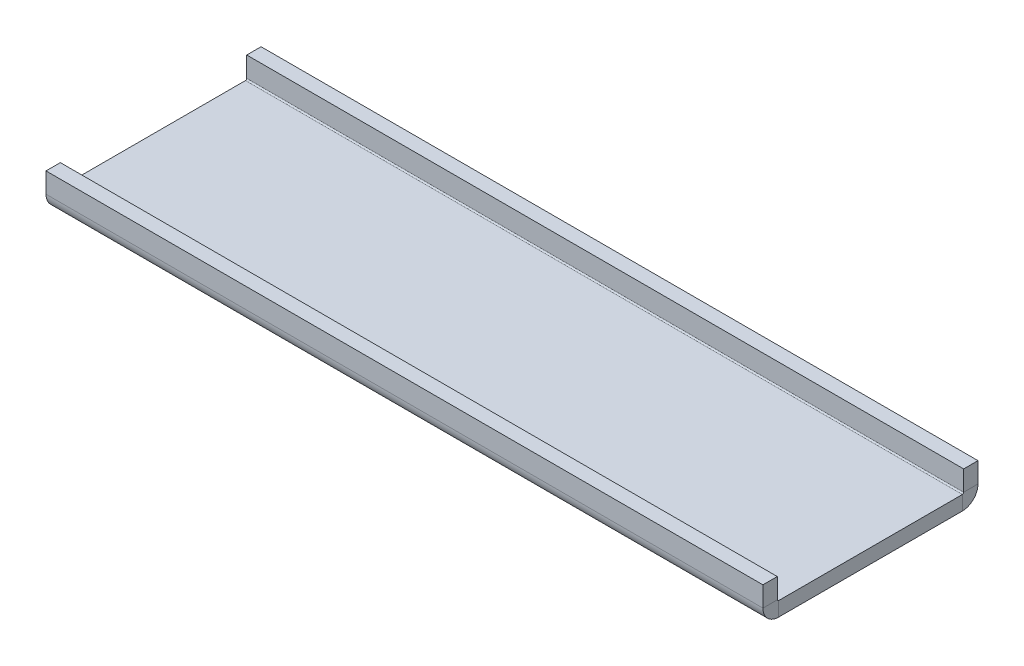
ISO-10303-21;
HEADER;
FILE_DESCRIPTION(('STEP AP214'),'2;1');
FILE_NAME('part.step','',(''),(''),'','','');
FILE_SCHEMA(('AUTOMOTIVE_DESIGN { 1 0 10303 214 1 1 1 1 }'));
ENDSEC;
DATA;
#1=APPLICATION_CONTEXT('core data for automotive mechanical design processes');
#2=APPLICATION_PROTOCOL_DEFINITION('international standard','automotive_design',2000,#1);
#3=PRODUCT_CONTEXT('',#1,'mechanical');
#4=PRODUCT('Part','Part','',(#3));
#5=PRODUCT_RELATED_PRODUCT_CATEGORY('part','',(#4));
#6=PRODUCT_DEFINITION_FORMATION('','',#4);
#7=PRODUCT_DEFINITION_CONTEXT('part definition',#1,'design');
#8=PRODUCT_DEFINITION('design','',#6,#7);
#9=PRODUCT_DEFINITION_SHAPE('','',#8);
#10=(LENGTH_UNIT() NAMED_UNIT(*) SI_UNIT(.MILLI.,.METRE.));
#11=(NAMED_UNIT(*) PLANE_ANGLE_UNIT() SI_UNIT($,.RADIAN.));
#12=(NAMED_UNIT(*) SI_UNIT($,.STERADIAN.) SOLID_ANGLE_UNIT());
#13=UNCERTAINTY_MEASURE_WITH_UNIT(LENGTH_MEASURE(1.E-05),#10,'distance_accuracy_value','');
#14=(GEOMETRIC_REPRESENTATION_CONTEXT(3) GLOBAL_UNCERTAINTY_ASSIGNED_CONTEXT((#13)) GLOBAL_UNIT_ASSIGNED_CONTEXT((#10,
#11,#12)) REPRESENTATION_CONTEXT('',''));
#15=CARTESIAN_POINT('',(0.,0.,0.));
#16=DIRECTION('',(0.,0.,1.));
#17=DIRECTION('',(1.,0.,0.));
#18=AXIS2_PLACEMENT_3D('',#15,#16,#17);
#19=CARTESIAN_POINT('',(0.,-4.,0.));
#20=DIRECTION('',(0.,1.,0.));
#21=DIRECTION('',(0.,0.,1.));
#22=AXIS2_PLACEMENT_3D('',#19,#20,#21);
#23=PLANE('',#22);
#24=DIRECTION('',(-1.,0.,0.));
#25=VECTOR('',#24,1.);
#26=CARTESIAN_POINT('',(-200.,-4.,-111.2634));
#27=LINE('',#26,#25);
#28=CARTESIAN_POINT('',(-200.,-4.,-111.2634));
#29=VERTEX_POINT('',#28);
#30=CARTESIAN_POINT('',(200.,-4.,-111.2634));
#31=VERTEX_POINT('',#30);
#32=EDGE_CURVE('E181',#29,#31,#27,.F.);
#33=ORIENTED_EDGE('',*,*,#32,.T.);
#34=DIRECTION('',(0.,0.,-1.));
#35=VECTOR('',#34,1.);
#36=CARTESIAN_POINT('',(200.,-4.,0.));
#37=LINE('',#36,#35);
#38=CARTESIAN_POINT('',(200.,-4.,-8.7366));
#39=VERTEX_POINT('',#38);
#40=EDGE_CURVE('E92',#39,#31,#37,.T.);
#41=ORIENTED_EDGE('',*,*,#40,.F.);
#42=DIRECTION('',(1.,0.,0.));
#43=VECTOR('',#42,1.);
#44=CARTESIAN_POINT('',(200.,-4.,-8.7366));
#45=LINE('',#44,#43);
#46=CARTESIAN_POINT('',(-200.,-4.,-8.7366));
#47=VERTEX_POINT('',#46);
#48=EDGE_CURVE('E276',#39,#47,#45,.F.);
#49=ORIENTED_EDGE('',*,*,#48,.T.);
#50=DIRECTION('',(0.,0.,1.));
#51=VECTOR('',#50,1.);
#52=CARTESIAN_POINT('',(-200.,-4.,-120.));
#53=LINE('',#52,#51);
#54=EDGE_CURVE('E13',#29,#47,#53,.T.);
#55=ORIENTED_EDGE('',*,*,#54,.F.);
#56=EDGE_LOOP('',(#33,#41,#49,#55));
#57=FACE_BOUND('',#56,.T.);
#58=ADVANCED_FACE('F83',(#57),#23,.F.);
#59=CARTESIAN_POINT('',(0.,4.,0.));
#60=DIRECTION('',(0.,1.,0.));
#61=DIRECTION('',(0.,0.,1.));
#62=AXIS2_PLACEMENT_3D('',#59,#60,#61);
#63=PLANE('',#62);
#64=DIRECTION('',(0.,0.,-1.));
#65=VECTOR('',#64,1.);
#66=CARTESIAN_POINT('',(200.,4.,0.));
#67=LINE('',#66,#65);
#68=CARTESIAN_POINT('',(200.,4.,-8.7366));
#69=VERTEX_POINT('',#68);
#70=CARTESIAN_POINT('',(200.,4.,-111.2634));
#71=VERTEX_POINT('',#70);
#72=EDGE_CURVE('E294',#69,#71,#67,.T.);
#73=ORIENTED_EDGE('',*,*,#72,.T.);
#74=DIRECTION('',(-1.,0.,0.));
#75=VECTOR('',#74,1.);
#76=CARTESIAN_POINT('',(-200.,4.,-111.2634));
#77=LINE('',#76,#75);
#78=CARTESIAN_POINT('',(-200.,4.,-111.2634));
#79=VERTEX_POINT('',#78);
#80=EDGE_CURVE('E235',#79,#71,#77,.F.);
#81=ORIENTED_EDGE('',*,*,#80,.F.);
#82=DIRECTION('',(0.,0.,1.));
#83=VECTOR('',#82,1.);
#84=CARTESIAN_POINT('',(-200.,4.,-120.));
#85=LINE('',#84,#83);
#86=CARTESIAN_POINT('',(-200.,4.,-8.7366));
#87=VERTEX_POINT('',#86);
#88=EDGE_CURVE('E87',#79,#87,#85,.T.);
#89=ORIENTED_EDGE('',*,*,#88,.T.);
#90=DIRECTION('',(1.,0.,0.));
#91=VECTOR('',#90,1.);
#92=CARTESIAN_POINT('',(200.,4.,-8.7366));
#93=LINE('',#92,#91);
#94=EDGE_CURVE('E100',#69,#87,#93,.F.);
#95=ORIENTED_EDGE('',*,*,#94,.F.);
#96=EDGE_LOOP('',(#73,#81,#89,#95));
#97=FACE_BOUND('',#96,.T.);
#98=ADVANCED_FACE('F299',(#97),#63,.T.);
#99=CARTESIAN_POINT('',(-200.,-4.,-120.));
#100=DIRECTION('',(-1.,0.,0.));
#101=DIRECTION('',(0.,0.,1.));
#102=AXIS2_PLACEMENT_3D('',#99,#100,#101);
#103=PLANE('',#102);
#104=ORIENTED_EDGE('',*,*,#88,.F.);
#105=DIRECTION('',(0.,-1.,0.));
#106=VECTOR('',#105,1.);
#107=CARTESIAN_POINT('',(-200.,4.,-111.2634));
#108=LINE('',#107,#106);
#109=EDGE_CURVE('E231',#79,#29,#108,.T.);
#110=ORIENTED_EDGE('',*,*,#109,.T.);
#111=ORIENTED_EDGE('',*,*,#54,.T.);
#112=DIRECTION('',(0.,-1.,0.));
#113=VECTOR('',#112,1.);
#114=CARTESIAN_POINT('',(-200.,4.,-8.7366));
#115=LINE('',#114,#113);
#116=EDGE_CURVE('E291',#87,#47,#115,.T.);
#117=ORIENTED_EDGE('',*,*,#116,.F.);
#118=EDGE_LOOP('',(#104,#110,#111,#117));
#119=FACE_BOUND('',#118,.T.);
#120=ADVANCED_FACE('F300',(#119),#103,.T.);
#121=CARTESIAN_POINT('',(200.,-4.,0.));
#122=DIRECTION('',(1.,0.,0.));
#123=DIRECTION('',(0.,0.,-1.));
#124=AXIS2_PLACEMENT_3D('',#121,#122,#123);
#125=PLANE('',#124);
#126=DIRECTION('',(0.,-1.,0.));
#127=VECTOR('',#126,1.);
#128=CARTESIAN_POINT('',(200.,4.,-111.2634));
#129=LINE('',#128,#127);
#130=EDGE_CURVE('E239',#71,#31,#129,.T.);
#131=ORIENTED_EDGE('',*,*,#130,.F.);
#132=ORIENTED_EDGE('',*,*,#72,.F.);
#133=DIRECTION('',(0.,-1.,0.));
#134=VECTOR('',#133,1.);
#135=CARTESIAN_POINT('',(200.,4.,-8.7366));
#136=LINE('',#135,#134);
#137=EDGE_CURVE('E282',#69,#39,#136,.T.);
#138=ORIENTED_EDGE('',*,*,#137,.T.);
#139=ORIENTED_EDGE('',*,*,#40,.T.);
#140=EDGE_LOOP('',(#131,#132,#138,#139));
#141=FACE_BOUND('',#140,.T.);
#142=ADVANCED_FACE('F85',(#141),#125,.T.);
#143=CARTESIAN_POINT('',(-200.,4.7366,-8.7366));
#144=DIRECTION('',(-1.,0.,0.));
#145=DIRECTION('',(0.,0.,1.));
#146=AXIS2_PLACEMENT_3D('',#143,#144,#145);
#147=PLANE('',#146);
#148=DIRECTION('',(0.,0.,1.));
#149=VECTOR('',#148,1.);
#150=CARTESIAN_POINT('',(-200.,4.7366,0.));
#151=LINE('',#150,#149);
#152=CARTESIAN_POINT('',(-200.,4.73659999999999,-8.));
#153=VERTEX_POINT('',#152);
#154=CARTESIAN_POINT('',(-200.,4.73659999999997,0.));
#155=VERTEX_POINT('',#154);
#156=EDGE_CURVE('E242',#153,#155,#151,.T.);
#157=ORIENTED_EDGE('',*,*,#156,.F.);
#158=CARTESIAN_POINT('',(-200.,4.7366,-8.7366));
#159=DIRECTION('',(1.,0.,0.));
#160=DIRECTION('',(0.,0.,-1.));
#161=AXIS2_PLACEMENT_3D('',#158,#159,#160);
#162=CIRCLE('',#161,0.7366);
#163=EDGE_CURVE('E285',#87,#153,#162,.F.);
#164=ORIENTED_EDGE('',*,*,#163,.F.);
#165=ORIENTED_EDGE('',*,*,#116,.T.);
#166=CARTESIAN_POINT('',(-200.,4.7366,-8.7366));
#167=DIRECTION('',(1.,0.,0.));
#168=DIRECTION('',(0.,0.,-1.));
#169=AXIS2_PLACEMENT_3D('',#166,#167,#168);
#170=CIRCLE('',#169,8.7366);
#171=EDGE_CURVE('E278',#47,#155,#170,.F.);
#172=ORIENTED_EDGE('',*,*,#171,.T.);
#173=EDGE_LOOP('',(#157,#164,#165,#172));
#174=FACE_BOUND('',#173,.T.);
#175=ADVANCED_FACE('F308',(#174),#147,.T.);
#176=CARTESIAN_POINT('',(200.,4.7366,-8.7366));
#177=DIRECTION('',(-1.,0.,0.));
#178=DIRECTION('',(0.,0.,1.));
#179=AXIS2_PLACEMENT_3D('',#176,#177,#178);
#180=PLANE('',#179);
#181=CARTESIAN_POINT('',(200.,4.7366,-8.7366));
#182=DIRECTION('',(1.,0.,0.));
#183=DIRECTION('',(0.,0.,-1.));
#184=AXIS2_PLACEMENT_3D('',#181,#182,#183);
#185=CIRCLE('',#184,0.7366);
#186=CARTESIAN_POINT('',(200.,4.73659999999999,-8.));
#187=VERTEX_POINT('',#186);
#188=EDGE_CURVE('E246',#187,#69,#185,.T.);
#189=ORIENTED_EDGE('',*,*,#188,.F.);
#190=DIRECTION('',(0.,0.,1.));
#191=VECTOR('',#190,1.);
#192=CARTESIAN_POINT('',(200.,4.7366,-8.));
#193=LINE('',#192,#191);
#194=CARTESIAN_POINT('',(200.,4.7366,0.));
#195=VERTEX_POINT('',#194);
#196=EDGE_CURVE('E269',#187,#195,#193,.T.);
#197=ORIENTED_EDGE('',*,*,#196,.T.);
#198=CARTESIAN_POINT('',(200.,4.7366,-8.7366));
#199=DIRECTION('',(1.,0.,0.));
#200=DIRECTION('',(0.,0.,-1.));
#201=AXIS2_PLACEMENT_3D('',#198,#199,#200);
#202=CIRCLE('',#201,8.7366);
#203=EDGE_CURVE('E279',#195,#39,#202,.T.);
#204=ORIENTED_EDGE('',*,*,#203,.T.);
#205=ORIENTED_EDGE('',*,*,#137,.F.);
#206=EDGE_LOOP('',(#189,#197,#204,#205));
#207=FACE_BOUND('',#206,.T.);
#208=ADVANCED_FACE('F328',(#207),#180,.F.);
#209=CARTESIAN_POINT('',(200.,4.7366,-8.7366));
#210=DIRECTION('',(1.,0.,0.));
#211=DIRECTION('',(0.,0.,1.));
#212=AXIS2_PLACEMENT_3D('',#209,#210,#211);
#213=CYLINDRICAL_SURFACE('',#212,8.7366);
#214=ORIENTED_EDGE('',*,*,#48,.F.);
#215=ORIENTED_EDGE('',*,*,#203,.F.);
#216=DIRECTION('',(1.,0.,0.));
#217=VECTOR('',#216,1.);
#218=CARTESIAN_POINT('',(0.,4.7366,0.));
#219=LINE('',#218,#217);
#220=EDGE_CURVE('E266',#155,#195,#219,.T.);
#221=ORIENTED_EDGE('',*,*,#220,.F.);
#222=ORIENTED_EDGE('',*,*,#171,.F.);
#223=EDGE_LOOP('',(#214,#215,#221,#222));
#224=FACE_BOUND('',#223,.T.);
#225=ADVANCED_FACE('F333',(#224),#213,.T.);
#226=CARTESIAN_POINT('',(200.,4.7366,-8.7366));
#227=DIRECTION('',(1.,0.,0.));
#228=DIRECTION('',(0.,0.,1.));
#229=AXIS2_PLACEMENT_3D('',#226,#227,#228);
#230=CYLINDRICAL_SURFACE('',#229,0.7366);
#231=ORIENTED_EDGE('',*,*,#94,.T.);
#232=ORIENTED_EDGE('',*,*,#163,.T.);
#233=DIRECTION('',(-1.,0.,0.));
#234=VECTOR('',#233,1.);
#235=CARTESIAN_POINT('',(-200.,4.7366,-8.));
#236=LINE('',#235,#234);
#237=EDGE_CURVE('E272',#153,#187,#236,.F.);
#238=ORIENTED_EDGE('',*,*,#237,.T.);
#239=ORIENTED_EDGE('',*,*,#188,.T.);
#240=EDGE_LOOP('',(#231,#232,#238,#239));
#241=FACE_BOUND('',#240,.T.);
#242=ADVANCED_FACE('F305',(#241),#230,.F.);
#243=CARTESIAN_POINT('',(200.,3.99999999999997,0.));
#244=DIRECTION('',(1.,0.,0.));
#245=DIRECTION('',(0.,0.,-1.));
#246=AXIS2_PLACEMENT_3D('',#243,#244,#245);
#247=PLANE('',#246);
#248=DIRECTION('',(0.,-1.,0.));
#249=VECTOR('',#248,1.);
#250=CARTESIAN_POINT('',(200.,3.99999999999997,0.));
#251=LINE('',#250,#249);
#252=CARTESIAN_POINT('',(200.,16.,0.));
#253=VERTEX_POINT('',#252);
#254=EDGE_CURVE('E250',#253,#195,#251,.T.);
#255=ORIENTED_EDGE('',*,*,#254,.T.);
#256=ORIENTED_EDGE('',*,*,#196,.F.);
#257=DIRECTION('',(0.,1.,0.));
#258=VECTOR('',#257,1.);
#259=CARTESIAN_POINT('',(200.,0.,-8.00000000000001));
#260=LINE('',#259,#258);
#261=CARTESIAN_POINT('',(200.,16.,-7.99999999999996));
#262=VERTEX_POINT('',#261);
#263=EDGE_CURVE('E258',#262,#187,#260,.F.);
#264=ORIENTED_EDGE('',*,*,#263,.F.);
#265=DIRECTION('',(0.,0.,-1.));
#266=VECTOR('',#265,1.);
#267=CARTESIAN_POINT('',(200.,16.,0.));
#268=LINE('',#267,#266);
#269=EDGE_CURVE('E244',#253,#262,#268,.T.);
#270=ORIENTED_EDGE('',*,*,#269,.F.);
#271=EDGE_LOOP('',(#255,#256,#264,#270));
#272=FACE_BOUND('',#271,.T.);
#273=ADVANCED_FACE('F326',(#272),#247,.T.);
#274=CARTESIAN_POINT('',(-200.,16.,0.));
#275=DIRECTION('',(-1.,0.,0.));
#276=DIRECTION('',(0.,0.,1.));
#277=AXIS2_PLACEMENT_3D('',#274,#275,#276);
#278=PLANE('',#277);
#279=DIRECTION('',(0.,-1.,0.));
#280=VECTOR('',#279,1.);
#281=CARTESIAN_POINT('',(-200.,0.,-8.00000000000001));
#282=LINE('',#281,#280);
#283=CARTESIAN_POINT('',(-200.,16.,-7.99999999999996));
#284=VERTEX_POINT('',#283);
#285=EDGE_CURVE('E264',#153,#284,#282,.F.);
#286=ORIENTED_EDGE('',*,*,#285,.F.);
#287=ORIENTED_EDGE('',*,*,#156,.T.);
#288=DIRECTION('',(0.,1.,0.));
#289=VECTOR('',#288,1.);
#290=CARTESIAN_POINT('',(-200.,16.,0.));
#291=LINE('',#290,#289);
#292=CARTESIAN_POINT('',(-200.,16.,0.));
#293=VERTEX_POINT('',#292);
#294=EDGE_CURVE('E256',#155,#293,#291,.T.);
#295=ORIENTED_EDGE('',*,*,#294,.T.);
#296=DIRECTION('',(0.,0.,-1.));
#297=VECTOR('',#296,1.);
#298=CARTESIAN_POINT('',(-200.,16.,0.));
#299=LINE('',#298,#297);
#300=EDGE_CURVE('E247',#293,#284,#299,.T.);
#301=ORIENTED_EDGE('',*,*,#300,.T.);
#302=EDGE_LOOP('',(#286,#287,#295,#301));
#303=FACE_BOUND('',#302,.T.);
#304=ADVANCED_FACE('F312',(#303),#278,.T.);
#305=CARTESIAN_POINT('',(0.,0.,0.));
#306=DIRECTION('',(0.,0.,1.));
#307=DIRECTION('',(0.,-1.,0.));
#308=AXIS2_PLACEMENT_3D('',#305,#306,#307);
#309=PLANE('',#308);
#310=ORIENTED_EDGE('',*,*,#294,.F.);
#311=ORIENTED_EDGE('',*,*,#220,.T.);
#312=ORIENTED_EDGE('',*,*,#254,.F.);
#313=DIRECTION('',(1.,0.,0.));
#314=VECTOR('',#313,1.);
#315=CARTESIAN_POINT('',(200.,16.,0.));
#316=LINE('',#315,#314);
#317=EDGE_CURVE('E253',#293,#253,#316,.T.);
#318=ORIENTED_EDGE('',*,*,#317,.F.);
#319=EDGE_LOOP('',(#310,#311,#312,#318));
#320=FACE_BOUND('',#319,.T.);
#321=ADVANCED_FACE('F316',(#320),#309,.T.);
#322=CARTESIAN_POINT('',(0.,0.,-8.00000000000001));
#323=DIRECTION('',(0.,0.,1.));
#324=DIRECTION('',(0.,-1.,0.));
#325=AXIS2_PLACEMENT_3D('',#322,#323,#324);
#326=PLANE('',#325);
#327=ORIENTED_EDGE('',*,*,#237,.F.);
#328=ORIENTED_EDGE('',*,*,#285,.T.);
#329=DIRECTION('',(-1.,0.,0.));
#330=VECTOR('',#329,1.);
#331=CARTESIAN_POINT('',(0.,16.,-7.99999999999996));
#332=LINE('',#331,#330);
#333=EDGE_CURVE('E261',#284,#262,#332,.F.);
#334=ORIENTED_EDGE('',*,*,#333,.T.);
#335=ORIENTED_EDGE('',*,*,#263,.T.);
#336=EDGE_LOOP('',(#327,#328,#334,#335));
#337=FACE_BOUND('',#336,.T.);
#338=ADVANCED_FACE('F323',(#337),#326,.F.);
#339=CARTESIAN_POINT('',(200.,16.,0.));
#340=DIRECTION('',(0.,1.,0.));
#341=DIRECTION('',(0.,0.,1.));
#342=AXIS2_PLACEMENT_3D('',#339,#340,#341);
#343=PLANE('',#342);
#344=ORIENTED_EDGE('',*,*,#333,.F.);
#345=ORIENTED_EDGE('',*,*,#300,.F.);
#346=ORIENTED_EDGE('',*,*,#317,.T.);
#347=ORIENTED_EDGE('',*,*,#269,.T.);
#348=EDGE_LOOP('',(#344,#345,#346,#347));
#349=FACE_BOUND('',#348,.T.);
#350=ADVANCED_FACE('F320',(#349),#343,.T.);
#351=CARTESIAN_POINT('',(200.,4.7366,-111.2634));
#352=DIRECTION('',(1.,0.,0.));
#353=DIRECTION('',(0.,0.,-1.));
#354=AXIS2_PLACEMENT_3D('',#351,#352,#353);
#355=PLANE('',#354);
#356=DIRECTION('',(0.,0.,-1.));
#357=VECTOR('',#356,1.);
#358=CARTESIAN_POINT('',(200.,4.73660000000006,-120.));
#359=LINE('',#358,#357);
#360=CARTESIAN_POINT('',(200.,4.7366,-112.));
#361=VERTEX_POINT('',#360);
#362=CARTESIAN_POINT('',(200.,4.7366,-120.));
#363=VERTEX_POINT('',#362);
#364=EDGE_CURVE('E226',#361,#363,#359,.T.);
#365=ORIENTED_EDGE('',*,*,#364,.F.);
#366=CARTESIAN_POINT('',(200.,4.7366,-111.2634));
#367=DIRECTION('',(-1.,0.,0.));
#368=DIRECTION('',(0.,0.,1.));
#369=AXIS2_PLACEMENT_3D('',#366,#367,#368);
#370=CIRCLE('',#369,0.736600000000004);
#371=EDGE_CURVE('E184',#71,#361,#370,.F.);
#372=ORIENTED_EDGE('',*,*,#371,.F.);
#373=ORIENTED_EDGE('',*,*,#130,.T.);
#374=CARTESIAN_POINT('',(200.,4.7366,-111.2634));
#375=DIRECTION('',(-1.,0.,0.));
#376=DIRECTION('',(0.,0.,1.));
#377=AXIS2_PLACEMENT_3D('',#374,#375,#376);
#378=CIRCLE('',#377,8.7366);
#379=EDGE_CURVE('E230',#31,#363,#378,.F.);
#380=ORIENTED_EDGE('',*,*,#379,.T.);
#381=EDGE_LOOP('',(#365,#372,#373,#380));
#382=FACE_BOUND('',#381,.T.);
#383=ADVANCED_FACE('F384',(#382),#355,.T.);
#384=CARTESIAN_POINT('',(-200.,4.7366,-111.2634));
#385=DIRECTION('',(1.,0.,0.));
#386=DIRECTION('',(0.,0.,-1.));
#387=AXIS2_PLACEMENT_3D('',#384,#385,#386);
#388=PLANE('',#387);
#389=CARTESIAN_POINT('',(-200.,4.7366,-111.2634));
#390=DIRECTION('',(-1.,0.,0.));
#391=DIRECTION('',(0.,0.,1.));
#392=AXIS2_PLACEMENT_3D('',#389,#390,#391);
#393=CIRCLE('',#392,0.736600000000004);
#394=CARTESIAN_POINT('',(-200.,4.7366,-112.));
#395=VERTEX_POINT('',#394);
#396=EDGE_CURVE('E191',#395,#79,#393,.T.);
#397=ORIENTED_EDGE('',*,*,#396,.F.);
#398=DIRECTION('',(0.,0.,-1.));
#399=VECTOR('',#398,1.);
#400=CARTESIAN_POINT('',(-200.,4.73660000000001,-112.));
#401=LINE('',#400,#399);
#402=CARTESIAN_POINT('',(-200.,4.73660000000006,-120.));
#403=VERTEX_POINT('',#402);
#404=EDGE_CURVE('E188',#395,#403,#401,.T.);
#405=ORIENTED_EDGE('',*,*,#404,.T.);
#406=CARTESIAN_POINT('',(-200.,4.7366,-111.2634));
#407=DIRECTION('',(-1.,0.,0.));
#408=DIRECTION('',(0.,0.,1.));
#409=AXIS2_PLACEMENT_3D('',#406,#407,#408);
#410=CIRCLE('',#409,8.7366);
#411=EDGE_CURVE('E174',#403,#29,#410,.T.);
#412=ORIENTED_EDGE('',*,*,#411,.T.);
#413=ORIENTED_EDGE('',*,*,#109,.F.);
#414=EDGE_LOOP('',(#397,#405,#412,#413));
#415=FACE_BOUND('',#414,.T.);
#416=ADVANCED_FACE('F189',(#415),#388,.F.);
#417=CARTESIAN_POINT('',(-200.,4.7366,-111.2634));
#418=DIRECTION('',(-1.,0.,0.));
#419=DIRECTION('',(0.,0.,-1.));
#420=AXIS2_PLACEMENT_3D('',#417,#418,#419);
#421=CYLINDRICAL_SURFACE('',#420,8.7366);
#422=ORIENTED_EDGE('',*,*,#32,.F.);
#423=ORIENTED_EDGE('',*,*,#411,.F.);
#424=DIRECTION('',(-1.,0.,0.));
#425=VECTOR('',#424,1.);
#426=CARTESIAN_POINT('',(0.,4.73660000000006,-120.));
#427=LINE('',#426,#425);
#428=EDGE_CURVE('E179',#363,#403,#427,.T.);
#429=ORIENTED_EDGE('',*,*,#428,.F.);
#430=ORIENTED_EDGE('',*,*,#379,.F.);
#431=EDGE_LOOP('',(#422,#423,#429,#430));
#432=FACE_BOUND('',#431,.T.);
#433=ADVANCED_FACE('F176',(#432),#421,.T.);
#434=CARTESIAN_POINT('',(-200.,4.7366,-111.2634));
#435=DIRECTION('',(-1.,0.,0.));
#436=DIRECTION('',(0.,0.,-1.));
#437=AXIS2_PLACEMENT_3D('',#434,#435,#436);
#438=CYLINDRICAL_SURFACE('',#437,0.736600000000004);
#439=ORIENTED_EDGE('',*,*,#80,.T.);
#440=ORIENTED_EDGE('',*,*,#371,.T.);
#441=DIRECTION('',(1.,0.,0.));
#442=VECTOR('',#441,1.);
#443=CARTESIAN_POINT('',(200.,4.73660000000001,-112.));
#444=LINE('',#443,#442);
#445=EDGE_CURVE('E196',#361,#395,#444,.F.);
#446=ORIENTED_EDGE('',*,*,#445,.T.);
#447=ORIENTED_EDGE('',*,*,#396,.T.);
#448=EDGE_LOOP('',(#439,#440,#446,#447));
#449=FACE_BOUND('',#448,.T.);
#450=ADVANCED_FACE('F336',(#449),#438,.F.);
#451=CARTESIAN_POINT('',(-200.,4.,-120.));
#452=DIRECTION('',(-1.,0.,0.));
#453=DIRECTION('',(0.,0.,1.));
#454=AXIS2_PLACEMENT_3D('',#451,#452,#453);
#455=PLANE('',#454);
#456=DIRECTION('',(0.,-1.,0.));
#457=VECTOR('',#456,1.);
#458=CARTESIAN_POINT('',(-200.,4.,-120.));
#459=LINE('',#458,#457);
#460=CARTESIAN_POINT('',(-200.,16.,-120.));
#461=VERTEX_POINT('',#460);
#462=EDGE_CURVE('E203',#461,#403,#459,.T.);
#463=ORIENTED_EDGE('',*,*,#462,.T.);
#464=ORIENTED_EDGE('',*,*,#404,.F.);
#465=DIRECTION('',(0.,1.,0.));
#466=VECTOR('',#465,1.);
#467=CARTESIAN_POINT('',(-200.,0.,-112.));
#468=LINE('',#467,#466);
#469=CARTESIAN_POINT('',(-200.,16.,-112.));
#470=VERTEX_POINT('',#469);
#471=EDGE_CURVE('E219',#470,#395,#468,.F.);
#472=ORIENTED_EDGE('',*,*,#471,.F.);
#473=DIRECTION('',(0.,0.,1.));
#474=VECTOR('',#473,1.);
#475=CARTESIAN_POINT('',(-200.,16.,-120.));
#476=LINE('',#475,#474);
#477=EDGE_CURVE('E208',#461,#470,#476,.T.);
#478=ORIENTED_EDGE('',*,*,#477,.F.);
#479=EDGE_LOOP('',(#463,#464,#472,#478));
#480=FACE_BOUND('',#479,.T.);
#481=ADVANCED_FACE('F207',(#480),#455,.T.);
#482=CARTESIAN_POINT('',(200.,16.,-120.));
#483=DIRECTION('',(1.,0.,0.));
#484=DIRECTION('',(0.,0.,-1.));
#485=AXIS2_PLACEMENT_3D('',#482,#483,#484);
#486=PLANE('',#485);
#487=DIRECTION('',(0.,-1.,0.));
#488=VECTOR('',#487,1.);
#489=CARTESIAN_POINT('',(200.,0.,-112.));
#490=LINE('',#489,#488);
#491=CARTESIAN_POINT('',(200.,16.,-112.));
#492=VERTEX_POINT('',#491);
#493=EDGE_CURVE('E205',#361,#492,#490,.F.);
#494=ORIENTED_EDGE('',*,*,#493,.F.);
#495=ORIENTED_EDGE('',*,*,#364,.T.);
#496=DIRECTION('',(0.,1.,0.));
#497=VECTOR('',#496,1.);
#498=CARTESIAN_POINT('',(200.,16.,-120.));
#499=LINE('',#498,#497);
#500=CARTESIAN_POINT('',(200.,16.,-120.));
#501=VERTEX_POINT('',#500);
#502=EDGE_CURVE('E204',#363,#501,#499,.T.);
#503=ORIENTED_EDGE('',*,*,#502,.T.);
#504=DIRECTION('',(0.,0.,1.));
#505=VECTOR('',#504,1.);
#506=CARTESIAN_POINT('',(200.,16.,-120.));
#507=LINE('',#506,#505);
#508=EDGE_CURVE('E210',#501,#492,#507,.T.);
#509=ORIENTED_EDGE('',*,*,#508,.T.);
#510=EDGE_LOOP('',(#494,#495,#503,#509));
#511=FACE_BOUND('',#510,.T.);
#512=ADVANCED_FACE('F343',(#511),#486,.T.);
#513=CARTESIAN_POINT('',(0.,0.,-120.));
#514=DIRECTION('',(0.,0.,-1.));
#515=DIRECTION('',(-1.,0.,0.));
#516=AXIS2_PLACEMENT_3D('',#513,#514,#515);
#517=PLANE('',#516);
#518=ORIENTED_EDGE('',*,*,#502,.F.);
#519=ORIENTED_EDGE('',*,*,#428,.T.);
#520=ORIENTED_EDGE('',*,*,#462,.F.);
#521=DIRECTION('',(-1.,0.,0.));
#522=VECTOR('',#521,1.);
#523=CARTESIAN_POINT('',(-200.,16.,-120.));
#524=LINE('',#523,#522);
#525=EDGE_CURVE('E211',#501,#461,#524,.T.);
#526=ORIENTED_EDGE('',*,*,#525,.F.);
#527=EDGE_LOOP('',(#518,#519,#520,#526));
#528=FACE_BOUND('',#527,.T.);
#529=ADVANCED_FACE('F201',(#528),#517,.T.);
#530=CARTESIAN_POINT('',(0.,0.,-112.));
#531=DIRECTION('',(0.,0.,-1.));
#532=DIRECTION('',(-1.,0.,0.));
#533=AXIS2_PLACEMENT_3D('',#530,#531,#532);
#534=PLANE('',#533);
#535=ORIENTED_EDGE('',*,*,#445,.F.);
#536=ORIENTED_EDGE('',*,*,#493,.T.);
#537=DIRECTION('',(1.,0.,0.));
#538=VECTOR('',#537,1.);
#539=CARTESIAN_POINT('',(0.,16.,-112.));
#540=LINE('',#539,#538);
#541=EDGE_CURVE('E221',#492,#470,#540,.F.);
#542=ORIENTED_EDGE('',*,*,#541,.T.);
#543=ORIENTED_EDGE('',*,*,#471,.T.);
#544=EDGE_LOOP('',(#535,#536,#542,#543));
#545=FACE_BOUND('',#544,.T.);
#546=ADVANCED_FACE('F341',(#545),#534,.F.);
#547=CARTESIAN_POINT('',(-200.,16.,-120.));
#548=DIRECTION('',(0.,1.,0.));
#549=DIRECTION('',(0.,0.,1.));
#550=AXIS2_PLACEMENT_3D('',#547,#548,#549);
#551=PLANE('',#550);
#552=ORIENTED_EDGE('',*,*,#541,.F.);
#553=ORIENTED_EDGE('',*,*,#508,.F.);
#554=ORIENTED_EDGE('',*,*,#525,.T.);
#555=ORIENTED_EDGE('',*,*,#477,.T.);
#556=EDGE_LOOP('',(#552,#553,#554,#555));
#557=FACE_BOUND('',#556,.T.);
#558=ADVANCED_FACE('F347',(#557),#551,.T.);
#559=CLOSED_SHELL('',(#58,#98,#120,#142,#175,#208,#225,#242,#273,#304,#321,#338,#350,#383,#416,
#433,#450,#481,#512,#529,#546,#558));
#560=MANIFOLD_SOLID_BREP('B2',#559);
#561=ADVANCED_BREP_SHAPE_REPRESENTATION('',(#18,#560),#14);
#562=SHAPE_DEFINITION_REPRESENTATION(#9,#561);
ENDSEC;
END-ISO-10303-21;
